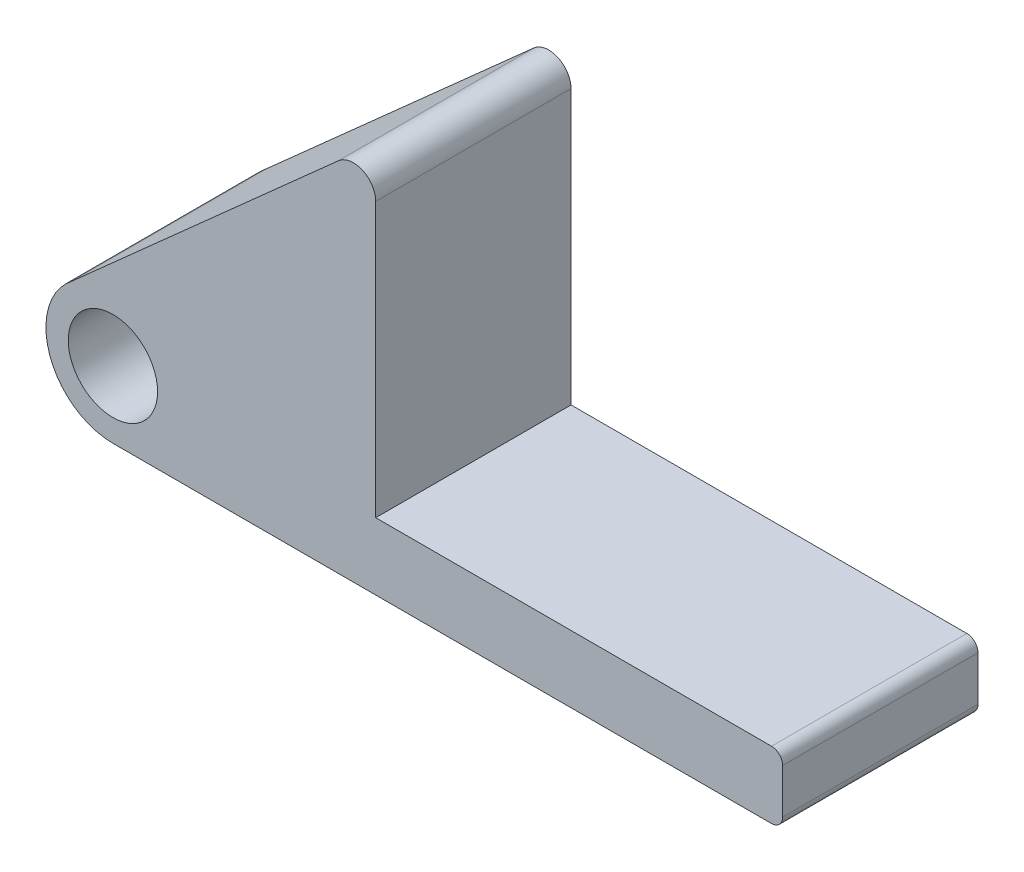
ISO-10303-21;
HEADER;
FILE_DESCRIPTION(('STEP AP214'),'2;1');
FILE_NAME('part.step','',(''),(''),'','','');
FILE_SCHEMA(('AUTOMOTIVE_DESIGN { 1 0 10303 214 1 1 1 1 }'));
ENDSEC;
DATA;
#1=APPLICATION_CONTEXT('core data for automotive mechanical design processes');
#2=APPLICATION_PROTOCOL_DEFINITION('international standard','automotive_design',2000,#1);
#3=PRODUCT_CONTEXT('',#1,'mechanical');
#4=PRODUCT('Part','Part','',(#3));
#5=PRODUCT_RELATED_PRODUCT_CATEGORY('part','',(#4));
#6=PRODUCT_DEFINITION_FORMATION('','',#4);
#7=PRODUCT_DEFINITION_CONTEXT('part definition',#1,'design');
#8=PRODUCT_DEFINITION('design','',#6,#7);
#9=PRODUCT_DEFINITION_SHAPE('','',#8);
#10=(LENGTH_UNIT() NAMED_UNIT(*) SI_UNIT(.MILLI.,.METRE.));
#11=(NAMED_UNIT(*) PLANE_ANGLE_UNIT() SI_UNIT($,.RADIAN.));
#12=(NAMED_UNIT(*) SI_UNIT($,.STERADIAN.) SOLID_ANGLE_UNIT());
#13=UNCERTAINTY_MEASURE_WITH_UNIT(LENGTH_MEASURE(1.E-05),#10,'distance_accuracy_value','');
#14=(GEOMETRIC_REPRESENTATION_CONTEXT(3) GLOBAL_UNCERTAINTY_ASSIGNED_CONTEXT((#13)) GLOBAL_UNIT_ASSIGNED_CONTEXT((#10,
#11,#12)) REPRESENTATION_CONTEXT('',''));
#15=CARTESIAN_POINT('',(0.,0.,0.));
#16=DIRECTION('',(0.,0.,1.));
#17=DIRECTION('',(1.,0.,0.));
#18=AXIS2_PLACEMENT_3D('',#15,#16,#17);
#19=CARTESIAN_POINT('',(0.,0.,-17.5));
#20=DIRECTION('',(0.,0.,1.));
#21=DIRECTION('',(1.,0.,0.));
#22=AXIS2_PLACEMENT_3D('',#19,#20,#21);
#23=CYLINDRICAL_SURFACE('',#22,6.);
#24=CARTESIAN_POINT('',(0.,0.,0.));
#25=DIRECTION('',(0.,0.,1.));
#26=DIRECTION('',(1.,0.,0.));
#27=AXIS2_PLACEMENT_3D('',#24,#25,#26);
#28=CIRCLE('',#27,6.);
#29=CARTESIAN_POINT('',(-3.67590678257598,4.74212076246609,0.));
#30=VERTEX_POINT('',#29);
#31=CARTESIAN_POINT('',(0.,-6.,0.));
#32=VERTEX_POINT('',#31);
#33=EDGE_CURVE('E153',#30,#32,#28,.T.);
#34=ORIENTED_EDGE('',*,*,#33,.F.);
#35=DIRECTION('',(0.,0.,1.));
#36=VECTOR('',#35,1.);
#37=CARTESIAN_POINT('',(-3.67590678257598,4.74212076246609,-17.5));
#38=LINE('',#37,#36);
#39=CARTESIAN_POINT('',(-3.67590678257598,4.74212076246609,-17.5));
#40=VERTEX_POINT('',#39);
#41=EDGE_CURVE('E135',#40,#30,#38,.T.);
#42=ORIENTED_EDGE('',*,*,#41,.F.);
#43=CARTESIAN_POINT('',(0.,0.,-17.5));
#44=DIRECTION('',(0.,0.,1.));
#45=DIRECTION('',(1.,0.,0.));
#46=AXIS2_PLACEMENT_3D('',#43,#44,#45);
#47=CIRCLE('',#46,6.);
#48=CARTESIAN_POINT('',(0.,-6.,-17.5));
#49=VERTEX_POINT('',#48);
#50=EDGE_CURVE('E118',#40,#49,#47,.T.);
#51=ORIENTED_EDGE('',*,*,#50,.T.);
#52=DIRECTION('',(0.,0.,1.));
#53=VECTOR('',#52,1.);
#54=CARTESIAN_POINT('',(0.,-6.,-17.5));
#55=LINE('',#54,#53);
#56=EDGE_CURVE('E126',#49,#32,#55,.T.);
#57=ORIENTED_EDGE('',*,*,#56,.T.);
#58=EDGE_LOOP('',(#34,#42,#51,#57));
#59=FACE_BOUND('',#58,.T.);
#60=ADVANCED_FACE('F42',(#59),#23,.T.);
#61=CARTESIAN_POINT('',(-3.98259826390751,4.46879686858001,-17.5));
#62=DIRECTION('',(0.665327715462425,-0.746551425581353,0.));
#63=DIRECTION('',(0.746551425581353,0.665327715462425,0.));
#64=AXIS2_PLACEMENT_3D('',#61,#62,#63);
#65=PLANE('',#64);
#66=DIRECTION('',(0.746551425581353,0.665327715462425,0.));
#67=VECTOR('',#66,1.);
#68=CARTESIAN_POINT('',(-3.98259826390751,4.46879686858001,0.));
#69=LINE('',#68,#67);
#70=CARTESIAN_POINT('',(20.2127372467274,26.0317150394239,0.));
#71=VERTEX_POINT('',#70);
#72=EDGE_CURVE('E140',#30,#71,#69,.T.);
#73=ORIENTED_EDGE('',*,*,#72,.T.);
#74=DIRECTION('',(0.,0.,1.));
#75=VECTOR('',#74,1.);
#76=CARTESIAN_POINT('',(20.2127372467274,26.0317150394239,-17.5));
#77=LINE('',#76,#75);
#78=CARTESIAN_POINT('',(20.2127372467274,26.0317150394239,-17.5));
#79=VERTEX_POINT('',#78);
#80=EDGE_CURVE('E173',#71,#79,#77,.F.);
#81=ORIENTED_EDGE('',*,*,#80,.T.);
#82=DIRECTION('',(0.746551425581353,0.665327715462425,0.));
#83=VECTOR('',#82,1.);
#84=CARTESIAN_POINT('',(-3.98259826390751,4.46879686858001,-17.5));
#85=LINE('',#84,#83);
#86=EDGE_CURVE('E133',#40,#79,#85,.T.);
#87=ORIENTED_EDGE('',*,*,#86,.F.);
#88=ORIENTED_EDGE('',*,*,#41,.T.);
#89=EDGE_LOOP('',(#73,#81,#87,#88));
#90=FACE_BOUND('',#89,.T.);
#91=ADVANCED_FACE('F194',(#90),#65,.F.);
#92=CARTESIAN_POINT('',(23.5433926776522,0.,-17.5));
#93=DIRECTION('',(-1.,0.,0.));
#94=DIRECTION('',(0.,0.,1.));
#95=AXIS2_PLACEMENT_3D('',#92,#93,#94);
#96=PLANE('',#95);
#97=DIRECTION('',(0.,-1.,0.));
#98=VECTOR('',#97,1.);
#99=CARTESIAN_POINT('',(23.5433926776522,0.,-17.5));
#100=LINE('',#99,#98);
#101=CARTESIAN_POINT('',(23.5433926776522,24.5386121882612,-17.5));
#102=VERTEX_POINT('',#101);
#103=CARTESIAN_POINT('',(23.5433926776522,0.,-17.5));
#104=VERTEX_POINT('',#103);
#105=EDGE_CURVE('E147',#102,#104,#100,.T.);
#106=ORIENTED_EDGE('',*,*,#105,.F.);
#107=DIRECTION('',(0.,0.,1.));
#108=VECTOR('',#107,1.);
#109=CARTESIAN_POINT('',(23.5433926776522,24.5386121882612,-17.5));
#110=LINE('',#109,#108);
#111=CARTESIAN_POINT('',(23.5433926776522,24.5386121882612,0.));
#112=VERTEX_POINT('',#111);
#113=EDGE_CURVE('E166',#102,#112,#110,.T.);
#114=ORIENTED_EDGE('',*,*,#113,.T.);
#115=DIRECTION('',(0.,-1.,0.));
#116=VECTOR('',#115,1.);
#117=CARTESIAN_POINT('',(23.5433926776522,0.,0.));
#118=LINE('',#117,#116);
#119=CARTESIAN_POINT('',(23.5433926776522,0.,0.));
#120=VERTEX_POINT('',#119);
#121=EDGE_CURVE('E161',#112,#120,#118,.T.);
#122=ORIENTED_EDGE('',*,*,#121,.T.);
#123=DIRECTION('',(0.,0.,1.));
#124=VECTOR('',#123,1.);
#125=CARTESIAN_POINT('',(23.5433926776522,0.,-17.5));
#126=LINE('',#125,#124);
#127=EDGE_CURVE('E132',#104,#120,#126,.T.);
#128=ORIENTED_EDGE('',*,*,#127,.F.);
#129=EDGE_LOOP('',(#106,#114,#122,#128));
#130=FACE_BOUND('',#129,.T.);
#131=ADVANCED_FACE('F203',(#130),#96,.F.);
#132=CARTESIAN_POINT('',(0.,0.,-17.5));
#133=DIRECTION('',(0.,-1.,0.));
#134=DIRECTION('',(1.,0.,0.));
#135=AXIS2_PLACEMENT_3D('',#132,#133,#134);
#136=PLANE('',#135);
#137=DIRECTION('',(1.,0.,0.));
#138=VECTOR('',#137,1.);
#139=CARTESIAN_POINT('',(0.,0.,0.));
#140=LINE('',#139,#138);
#141=CARTESIAN_POINT('',(59.,0.,0.));
#142=VERTEX_POINT('',#141);
#143=EDGE_CURVE('E158',#120,#142,#140,.T.);
#144=ORIENTED_EDGE('',*,*,#143,.T.);
#145=DIRECTION('',(0.,0.,1.));
#146=VECTOR('',#145,1.);
#147=CARTESIAN_POINT('',(59.,0.,-17.5));
#148=LINE('',#147,#146);
#149=CARTESIAN_POINT('',(59.,0.,-17.5));
#150=VERTEX_POINT('',#149);
#151=EDGE_CURVE('E182',#142,#150,#148,.F.);
#152=ORIENTED_EDGE('',*,*,#151,.T.);
#153=DIRECTION('',(1.,0.,0.));
#154=VECTOR('',#153,1.);
#155=CARTESIAN_POINT('',(0.,0.,-17.5));
#156=LINE('',#155,#154);
#157=EDGE_CURVE('E144',#104,#150,#156,.T.);
#158=ORIENTED_EDGE('',*,*,#157,.F.);
#159=ORIENTED_EDGE('',*,*,#127,.T.);
#160=EDGE_LOOP('',(#144,#152,#158,#159));
#161=FACE_BOUND('',#160,.T.);
#162=ADVANCED_FACE('F206',(#161),#136,.F.);
#163=CARTESIAN_POINT('',(60.,0.,-17.5));
#164=DIRECTION('',(-1.,0.,0.));
#165=DIRECTION('',(0.,0.,1.));
#166=AXIS2_PLACEMENT_3D('',#163,#164,#165);
#167=PLANE('',#166);
#168=DIRECTION('',(0.,-1.,0.));
#169=VECTOR('',#168,1.);
#170=CARTESIAN_POINT('',(60.,0.,0.));
#171=LINE('',#170,#169);
#172=CARTESIAN_POINT('',(60.,-1.,0.));
#173=VERTEX_POINT('',#172);
#174=CARTESIAN_POINT('',(60.,-5.,0.));
#175=VERTEX_POINT('',#174);
#176=EDGE_CURVE('E156',#173,#175,#171,.T.);
#177=ORIENTED_EDGE('',*,*,#176,.T.);
#178=DIRECTION('',(0.,0.,1.));
#179=VECTOR('',#178,1.);
#180=CARTESIAN_POINT('',(60.,-5.,-17.5));
#181=LINE('',#180,#179);
#182=CARTESIAN_POINT('',(60.,-5.,-17.5));
#183=VERTEX_POINT('',#182);
#184=EDGE_CURVE('E50',#175,#183,#181,.F.);
#185=ORIENTED_EDGE('',*,*,#184,.T.);
#186=DIRECTION('',(0.,-1.,0.));
#187=VECTOR('',#186,1.);
#188=CARTESIAN_POINT('',(60.,0.,-17.5));
#189=LINE('',#188,#187);
#190=CARTESIAN_POINT('',(60.,-1.,-17.5));
#191=VERTEX_POINT('',#190);
#192=EDGE_CURVE('E123',#191,#183,#189,.T.);
#193=ORIENTED_EDGE('',*,*,#192,.F.);
#194=DIRECTION('',(0.,0.,1.));
#195=VECTOR('',#194,1.);
#196=CARTESIAN_POINT('',(60.,-1.,-17.5));
#197=LINE('',#196,#195);
#198=EDGE_CURVE('E177',#191,#173,#197,.T.);
#199=ORIENTED_EDGE('',*,*,#198,.T.);
#200=EDGE_LOOP('',(#177,#185,#193,#199));
#201=FACE_BOUND('',#200,.T.);
#202=ADVANCED_FACE('F212',(#201),#167,.F.);
#203=CARTESIAN_POINT('',(0.,0.,-17.5));
#204=DIRECTION('',(0.,0.,1.));
#205=DIRECTION('',(1.,0.,0.));
#206=AXIS2_PLACEMENT_3D('',#203,#204,#205);
#207=CYLINDRICAL_SURFACE('',#206,4.);
#208=CARTESIAN_POINT('',(0.,0.,-17.5));
#209=DIRECTION('',(0.,0.,1.));
#210=DIRECTION('',(1.,0.,0.));
#211=AXIS2_PLACEMENT_3D('',#208,#209,#210);
#212=CIRCLE('',#211,4.);
#213=CARTESIAN_POINT('',(4.,0.,-17.5));
#214=VERTEX_POINT('',#213);
#215=EDGE_CURVE('E137',#214,#214,#212,.T.);
#216=ORIENTED_EDGE('',*,*,#215,.F.);
#217=EDGE_LOOP('',(#216));
#218=FACE_BOUND('',#217,.T.);
#219=CARTESIAN_POINT('',(0.,0.,0.));
#220=DIRECTION('',(0.,0.,1.));
#221=DIRECTION('',(1.,0.,0.));
#222=AXIS2_PLACEMENT_3D('',#219,#220,#221);
#223=CIRCLE('',#222,4.);
#224=CARTESIAN_POINT('',(4.,0.,0.));
#225=VERTEX_POINT('',#224);
#226=EDGE_CURVE('E150',#225,#225,#223,.T.);
#227=ORIENTED_EDGE('',*,*,#226,.T.);
#228=EDGE_LOOP('',(#227));
#229=FACE_BOUND('',#228,.T.);
#230=ADVANCED_FACE('F226',(#218,#229),#207,.F.);
#231=CARTESIAN_POINT('',(0.,-6.,-17.5));
#232=DIRECTION('',(0.,1.,0.));
#233=DIRECTION('',(-1.,0.,0.));
#234=AXIS2_PLACEMENT_3D('',#231,#232,#233);
#235=PLANE('',#234);
#236=DIRECTION('',(-1.,0.,0.));
#237=VECTOR('',#236,1.);
#238=CARTESIAN_POINT('',(0.,-6.,-17.5));
#239=LINE('',#238,#237);
#240=CARTESIAN_POINT('',(59.,-6.,-17.5));
#241=VERTEX_POINT('',#240);
#242=EDGE_CURVE('E113',#241,#49,#239,.T.);
#243=ORIENTED_EDGE('',*,*,#242,.F.);
#244=DIRECTION('',(0.,0.,1.));
#245=VECTOR('',#244,1.);
#246=CARTESIAN_POINT('',(59.,-6.,-17.5));
#247=LINE('',#246,#245);
#248=CARTESIAN_POINT('',(59.,-6.,0.));
#249=VERTEX_POINT('',#248);
#250=EDGE_CURVE('E186',#241,#249,#247,.T.);
#251=ORIENTED_EDGE('',*,*,#250,.T.);
#252=DIRECTION('',(-1.,0.,0.));
#253=VECTOR('',#252,1.);
#254=CARTESIAN_POINT('',(0.,-6.,0.));
#255=LINE('',#254,#253);
#256=EDGE_CURVE('E128',#249,#32,#255,.T.);
#257=ORIENTED_EDGE('',*,*,#256,.T.);
#258=ORIENTED_EDGE('',*,*,#56,.F.);
#259=EDGE_LOOP('',(#243,#251,#257,#258));
#260=FACE_BOUND('',#259,.T.);
#261=ADVANCED_FACE('F127',(#260),#235,.F.);
#262=CARTESIAN_POINT('',(0.,0.,-17.5));
#263=DIRECTION('',(0.,0.,1.));
#264=DIRECTION('',(1.,0.,0.));
#265=AXIS2_PLACEMENT_3D('',#262,#263,#264);
#266=PLANE('',#265);
#267=ORIENTED_EDGE('',*,*,#215,.T.);
#268=EDGE_LOOP('',(#267));
#269=FACE_BOUND('',#268,.T.);
#270=ORIENTED_EDGE('',*,*,#192,.T.);
#271=CARTESIAN_POINT('',(59.,-5.,-17.5));
#272=DIRECTION('',(0.,0.,1.));
#273=DIRECTION('',(1.,0.,0.));
#274=AXIS2_PLACEMENT_3D('',#271,#272,#273);
#275=CIRCLE('',#274,1.);
#276=EDGE_CURVE('E11',#183,#241,#275,.F.);
#277=ORIENTED_EDGE('',*,*,#276,.T.);
#278=ORIENTED_EDGE('',*,*,#242,.T.);
#279=ORIENTED_EDGE('',*,*,#50,.F.);
#280=ORIENTED_EDGE('',*,*,#86,.T.);
#281=CARTESIAN_POINT('',(21.5433926776522,24.5386121882612,-17.5));
#282=DIRECTION('',(0.,0.,1.));
#283=DIRECTION('',(1.,0.,0.));
#284=AXIS2_PLACEMENT_3D('',#281,#282,#283);
#285=CIRCLE('',#284,2.);
#286=EDGE_CURVE('E175',#79,#102,#285,.F.);
#287=ORIENTED_EDGE('',*,*,#286,.T.);
#288=ORIENTED_EDGE('',*,*,#105,.T.);
#289=ORIENTED_EDGE('',*,*,#157,.T.);
#290=CARTESIAN_POINT('',(59.,-1.,-17.5));
#291=DIRECTION('',(0.,0.,1.));
#292=DIRECTION('',(1.,0.,0.));
#293=AXIS2_PLACEMENT_3D('',#290,#291,#292);
#294=CIRCLE('',#293,1.);
#295=EDGE_CURVE('E184',#150,#191,#294,.F.);
#296=ORIENTED_EDGE('',*,*,#295,.T.);
#297=EDGE_LOOP('',(#270,#277,#278,#279,#280,#287,#288,#289,#296));
#298=FACE_BOUND('',#297,.T.);
#299=ADVANCED_FACE('F115',(#269,#298),#266,.F.);
#300=CARTESIAN_POINT('',(0.,0.,0.));
#301=DIRECTION('',(0.,0.,1.));
#302=DIRECTION('',(1.,0.,0.));
#303=AXIS2_PLACEMENT_3D('',#300,#301,#302);
#304=PLANE('',#303);
#305=ORIENTED_EDGE('',*,*,#226,.F.);
#306=EDGE_LOOP('',(#305));
#307=FACE_BOUND('',#306,.T.);
#308=ORIENTED_EDGE('',*,*,#256,.F.);
#309=CARTESIAN_POINT('',(59.,-5.,0.));
#310=DIRECTION('',(0.,0.,1.));
#311=DIRECTION('',(1.,0.,0.));
#312=AXIS2_PLACEMENT_3D('',#309,#310,#311);
#313=CIRCLE('',#312,1.);
#314=EDGE_CURVE('E64',#249,#175,#313,.T.);
#315=ORIENTED_EDGE('',*,*,#314,.T.);
#316=ORIENTED_EDGE('',*,*,#176,.F.);
#317=CARTESIAN_POINT('',(59.,-1.,0.));
#318=DIRECTION('',(0.,0.,1.));
#319=DIRECTION('',(1.,0.,0.));
#320=AXIS2_PLACEMENT_3D('',#317,#318,#319);
#321=CIRCLE('',#320,1.);
#322=EDGE_CURVE('E180',#173,#142,#321,.T.);
#323=ORIENTED_EDGE('',*,*,#322,.T.);
#324=ORIENTED_EDGE('',*,*,#143,.F.);
#325=ORIENTED_EDGE('',*,*,#121,.F.);
#326=CARTESIAN_POINT('',(21.5433926776522,24.5386121882612,0.));
#327=DIRECTION('',(0.,0.,1.));
#328=DIRECTION('',(1.,0.,0.));
#329=AXIS2_PLACEMENT_3D('',#326,#327,#328);
#330=CIRCLE('',#329,2.);
#331=EDGE_CURVE('E171',#112,#71,#330,.T.);
#332=ORIENTED_EDGE('',*,*,#331,.T.);
#333=ORIENTED_EDGE('',*,*,#72,.F.);
#334=ORIENTED_EDGE('',*,*,#33,.T.);
#335=EDGE_LOOP('',(#308,#315,#316,#323,#324,#325,#332,#333,#334));
#336=FACE_BOUND('',#335,.T.);
#337=ADVANCED_FACE('F189',(#307,#336),#304,.T.);
#338=CARTESIAN_POINT('',(21.5433926776522,24.5386121882612,-17.5));
#339=DIRECTION('',(0.,0.,1.));
#340=DIRECTION('',(1.,0.,0.));
#341=AXIS2_PLACEMENT_3D('',#338,#339,#340);
#342=CYLINDRICAL_SURFACE('',#341,2.);
#343=ORIENTED_EDGE('',*,*,#286,.F.);
#344=ORIENTED_EDGE('',*,*,#80,.F.);
#345=ORIENTED_EDGE('',*,*,#331,.F.);
#346=ORIENTED_EDGE('',*,*,#113,.F.);
#347=EDGE_LOOP('',(#343,#344,#345,#346));
#348=FACE_BOUND('',#347,.T.);
#349=ADVANCED_FACE('F197',(#348),#342,.T.);
#350=CARTESIAN_POINT('',(59.,-1.,-17.5));
#351=DIRECTION('',(0.,0.,1.));
#352=DIRECTION('',(1.,0.,0.));
#353=AXIS2_PLACEMENT_3D('',#350,#351,#352);
#354=CYLINDRICAL_SURFACE('',#353,1.);
#355=ORIENTED_EDGE('',*,*,#295,.F.);
#356=ORIENTED_EDGE('',*,*,#151,.F.);
#357=ORIENTED_EDGE('',*,*,#322,.F.);
#358=ORIENTED_EDGE('',*,*,#198,.F.);
#359=EDGE_LOOP('',(#355,#356,#357,#358));
#360=FACE_BOUND('',#359,.T.);
#361=ADVANCED_FACE('F211',(#360),#354,.T.);
#362=CARTESIAN_POINT('',(59.,-5.,-17.5));
#363=DIRECTION('',(0.,0.,1.));
#364=DIRECTION('',(1.,0.,0.));
#365=AXIS2_PLACEMENT_3D('',#362,#363,#364);
#366=CYLINDRICAL_SURFACE('',#365,1.);
#367=ORIENTED_EDGE('',*,*,#276,.F.);
#368=ORIENTED_EDGE('',*,*,#184,.F.);
#369=ORIENTED_EDGE('',*,*,#314,.F.);
#370=ORIENTED_EDGE('',*,*,#250,.F.);
#371=EDGE_LOOP('',(#367,#368,#369,#370));
#372=FACE_BOUND('',#371,.T.);
#373=ADVANCED_FACE('F44',(#372),#366,.T.);
#374=CLOSED_SHELL('',(#60,#91,#131,#162,#202,#230,#261,#299,#337,#349,#361,#373));
#375=MANIFOLD_SOLID_BREP('B2',#374);
#376=ADVANCED_BREP_SHAPE_REPRESENTATION('',(#18,#375),#14);
#377=SHAPE_DEFINITION_REPRESENTATION(#9,#376);
ENDSEC;
END-ISO-10303-21;
